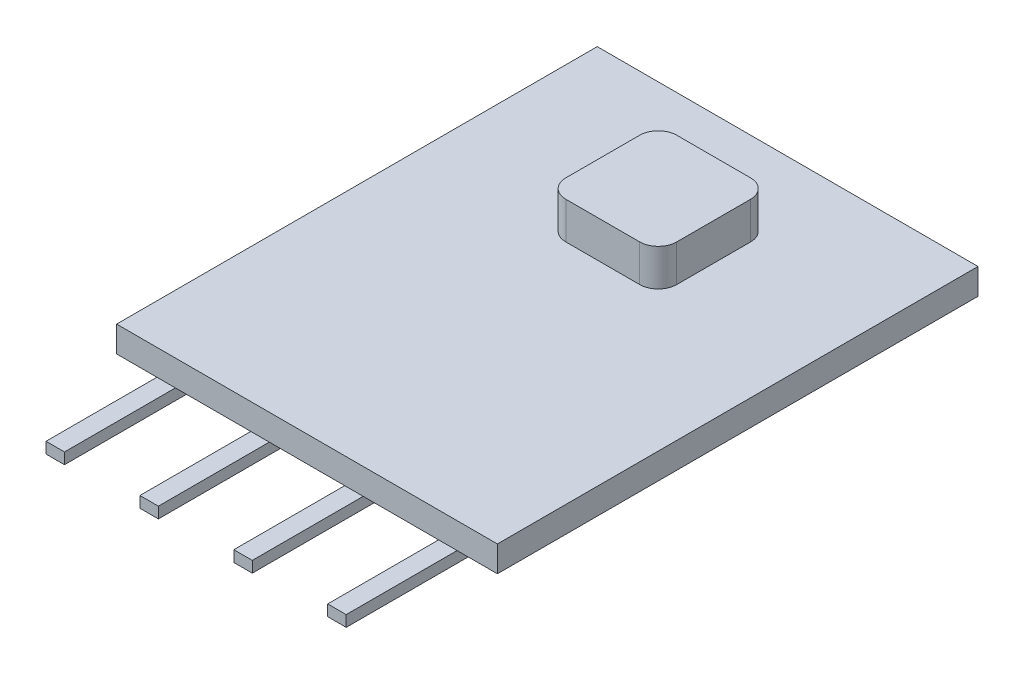
ISO-10303-21;
HEADER;
FILE_DESCRIPTION(('STEP AP214'),'2;1');
FILE_NAME('part.step','',(''),(''),'','','');
FILE_SCHEMA(('AUTOMOTIVE_DESIGN { 1 0 10303 214 1 1 1 1 }'));
ENDSEC;
DATA;
#1=APPLICATION_CONTEXT('core data for automotive mechanical design processes');
#2=APPLICATION_PROTOCOL_DEFINITION('international standard','automotive_design',2000,#1);
#3=PRODUCT_CONTEXT('',#1,'mechanical');
#4=PRODUCT('Part','Part','',(#3));
#5=PRODUCT_RELATED_PRODUCT_CATEGORY('part','',(#4));
#6=PRODUCT_DEFINITION_FORMATION('','',#4);
#7=PRODUCT_DEFINITION_CONTEXT('part definition',#1,'design');
#8=PRODUCT_DEFINITION('design','',#6,#7);
#9=PRODUCT_DEFINITION_SHAPE('','',#8);
#10=(LENGTH_UNIT() NAMED_UNIT(*) SI_UNIT(.MILLI.,.METRE.));
#11=(NAMED_UNIT(*) PLANE_ANGLE_UNIT() SI_UNIT($,.RADIAN.));
#12=(NAMED_UNIT(*) SI_UNIT($,.STERADIAN.) SOLID_ANGLE_UNIT());
#13=UNCERTAINTY_MEASURE_WITH_UNIT(LENGTH_MEASURE(1.E-05),#10,'distance_accuracy_value','');
#14=(GEOMETRIC_REPRESENTATION_CONTEXT(3) GLOBAL_UNCERTAINTY_ASSIGNED_CONTEXT((#13)) GLOBAL_UNIT_ASSIGNED_CONTEXT((#10,
#11,#12)) REPRESENTATION_CONTEXT('',''));
#15=CARTESIAN_POINT('',(0.,0.,0.));
#16=DIRECTION('',(0.,0.,1.));
#17=DIRECTION('',(1.,0.,0.));
#18=AXIS2_PLACEMENT_3D('',#15,#16,#17);
#19=CARTESIAN_POINT('',(1.5,1.7,-4.5));
#20=DIRECTION('',(-1.,0.,0.));
#21=DIRECTION('',(0.,0.,1.));
#22=AXIS2_PLACEMENT_3D('',#19,#20,#21);
#23=PLANE('',#22);
#24=DIRECTION('',(0.,0.,-1.));
#25=VECTOR('',#24,1.);
#26=CARTESIAN_POINT('',(1.5,0.7,-4.5));
#27=LINE('',#26,#25);
#28=CARTESIAN_POINT('',(1.5,0.7,-2.));
#29=VERTEX_POINT('',#28);
#30=CARTESIAN_POINT('',(1.5,0.7,-4.));
#31=VERTEX_POINT('',#30);
#32=EDGE_CURVE('E142',#29,#31,#27,.T.);
#33=ORIENTED_EDGE('',*,*,#32,.T.);
#34=DIRECTION('',(0.,-1.,0.));
#35=VECTOR('',#34,1.);
#36=CARTESIAN_POINT('',(1.5,1.7,-4.));
#37=LINE('',#36,#35);
#38=CARTESIAN_POINT('',(1.5,1.7,-4.));
#39=VERTEX_POINT('',#38);
#40=EDGE_CURVE('E164',#31,#39,#37,.F.);
#41=ORIENTED_EDGE('',*,*,#40,.T.);
#42=DIRECTION('',(0.,0.,-1.));
#43=VECTOR('',#42,1.);
#44=CARTESIAN_POINT('',(1.5,1.7,-4.5));
#45=LINE('',#44,#43);
#46=CARTESIAN_POINT('',(1.5,1.7,-2.));
#47=VERTEX_POINT('',#46);
#48=EDGE_CURVE('E140',#47,#39,#45,.T.);
#49=ORIENTED_EDGE('',*,*,#48,.F.);
#50=DIRECTION('',(0.,-1.,0.));
#51=VECTOR('',#50,1.);
#52=CARTESIAN_POINT('',(1.5,1.7,-2.));
#53=LINE('',#52,#51);
#54=EDGE_CURVE('E161',#47,#29,#53,.T.);
#55=ORIENTED_EDGE('',*,*,#54,.T.);
#56=EDGE_LOOP('',(#33,#41,#49,#55));
#57=FACE_BOUND('',#56,.T.);
#58=ADVANCED_FACE('F45',(#57),#23,.F.);
#59=CARTESIAN_POINT('',(-1.5,1.7,-4.5));
#60=DIRECTION('',(0.,0.,1.));
#61=DIRECTION('',(1.,0.,0.));
#62=AXIS2_PLACEMENT_3D('',#59,#60,#61);
#63=PLANE('',#62);
#64=DIRECTION('',(-1.,0.,0.));
#65=VECTOR('',#64,1.);
#66=CARTESIAN_POINT('',(-1.5,0.7,-4.5));
#67=LINE('',#66,#65);
#68=CARTESIAN_POINT('',(1.,0.7,-4.5));
#69=VERTEX_POINT('',#68);
#70=CARTESIAN_POINT('',(-1.,0.7,-4.5));
#71=VERTEX_POINT('',#70);
#72=EDGE_CURVE('E138',#69,#71,#67,.T.);
#73=ORIENTED_EDGE('',*,*,#72,.T.);
#74=DIRECTION('',(0.,-1.,0.));
#75=VECTOR('',#74,1.);
#76=CARTESIAN_POINT('',(-1.,1.7,-4.5));
#77=LINE('',#76,#75);
#78=CARTESIAN_POINT('',(-1.,1.7,-4.5));
#79=VERTEX_POINT('',#78);
#80=EDGE_CURVE('E116',#71,#79,#77,.F.);
#81=ORIENTED_EDGE('',*,*,#80,.T.);
#82=DIRECTION('',(-1.,0.,0.));
#83=VECTOR('',#82,1.);
#84=CARTESIAN_POINT('',(-1.5,1.7,-4.5));
#85=LINE('',#84,#83);
#86=CARTESIAN_POINT('',(1.,1.7,-4.5));
#87=VERTEX_POINT('',#86);
#88=EDGE_CURVE('E178',#87,#79,#85,.T.);
#89=ORIENTED_EDGE('',*,*,#88,.F.);
#90=DIRECTION('',(0.,-1.,0.));
#91=VECTOR('',#90,1.);
#92=CARTESIAN_POINT('',(1.,1.7,-4.5));
#93=LINE('',#92,#91);
#94=EDGE_CURVE('E121',#87,#69,#93,.T.);
#95=ORIENTED_EDGE('',*,*,#94,.T.);
#96=EDGE_LOOP('',(#73,#81,#89,#95));
#97=FACE_BOUND('',#96,.T.);
#98=ADVANCED_FACE('F183',(#97),#63,.F.);
#99=CARTESIAN_POINT('',(-1.5,1.7,-4.5));
#100=DIRECTION('',(1.,0.,0.));
#101=DIRECTION('',(0.,0.,-1.));
#102=AXIS2_PLACEMENT_3D('',#99,#100,#101);
#103=PLANE('',#102);
#104=DIRECTION('',(0.,0.,1.));
#105=VECTOR('',#104,1.);
#106=CARTESIAN_POINT('',(-1.5,1.7,-4.5));
#107=LINE('',#106,#105);
#108=CARTESIAN_POINT('',(-1.5,1.7,-4.));
#109=VERTEX_POINT('',#108);
#110=CARTESIAN_POINT('',(-1.5,1.7,-2.));
#111=VERTEX_POINT('',#110);
#112=EDGE_CURVE('E130',#109,#111,#107,.T.);
#113=ORIENTED_EDGE('',*,*,#112,.F.);
#114=DIRECTION('',(0.,-1.,0.));
#115=VECTOR('',#114,1.);
#116=CARTESIAN_POINT('',(-1.5,1.7,-4.));
#117=LINE('',#116,#115);
#118=CARTESIAN_POINT('',(-1.5,0.7,-4.));
#119=VERTEX_POINT('',#118);
#120=EDGE_CURVE('E115',#109,#119,#117,.T.);
#121=ORIENTED_EDGE('',*,*,#120,.T.);
#122=DIRECTION('',(0.,0.,1.));
#123=VECTOR('',#122,1.);
#124=CARTESIAN_POINT('',(-1.5,0.7,-4.5));
#125=LINE('',#124,#123);
#126=CARTESIAN_POINT('',(-1.5,0.7,-2.));
#127=VERTEX_POINT('',#126);
#128=EDGE_CURVE('E128',#119,#127,#125,.T.);
#129=ORIENTED_EDGE('',*,*,#128,.T.);
#130=DIRECTION('',(0.,-1.,0.));
#131=VECTOR('',#130,1.);
#132=CARTESIAN_POINT('',(-1.5,1.7,-2.));
#133=LINE('',#132,#131);
#134=EDGE_CURVE('E132',#127,#111,#133,.F.);
#135=ORIENTED_EDGE('',*,*,#134,.T.);
#136=EDGE_LOOP('',(#113,#121,#129,#135));
#137=FACE_BOUND('',#136,.T.);
#138=ADVANCED_FACE('F127',(#137),#103,.F.);
#139=CARTESIAN_POINT('',(-1.5,1.7,-1.5));
#140=DIRECTION('',(0.,0.,-1.));
#141=DIRECTION('',(-1.,0.,0.));
#142=AXIS2_PLACEMENT_3D('',#139,#140,#141);
#143=PLANE('',#142);
#144=DIRECTION('',(1.,0.,0.));
#145=VECTOR('',#144,1.);
#146=CARTESIAN_POINT('',(-1.5,1.7,-1.5));
#147=LINE('',#146,#145);
#148=CARTESIAN_POINT('',(-1.,1.7,-1.5));
#149=VERTEX_POINT('',#148);
#150=CARTESIAN_POINT('',(1.,1.7,-1.5));
#151=VERTEX_POINT('',#150);
#152=EDGE_CURVE('E146',#149,#151,#147,.T.);
#153=ORIENTED_EDGE('',*,*,#152,.F.);
#154=DIRECTION('',(0.,-1.,0.));
#155=VECTOR('',#154,1.);
#156=CARTESIAN_POINT('',(-1.,1.7,-1.5));
#157=LINE('',#156,#155);
#158=CARTESIAN_POINT('',(-1.,0.7,-1.5));
#159=VERTEX_POINT('',#158);
#160=EDGE_CURVE('E12',#149,#159,#157,.T.);
#161=ORIENTED_EDGE('',*,*,#160,.T.);
#162=DIRECTION('',(1.,0.,0.));
#163=VECTOR('',#162,1.);
#164=CARTESIAN_POINT('',(-1.5,0.7,-1.5));
#165=LINE('',#164,#163);
#166=CARTESIAN_POINT('',(1.,0.7,-1.5));
#167=VERTEX_POINT('',#166);
#168=EDGE_CURVE('E137',#159,#167,#165,.T.);
#169=ORIENTED_EDGE('',*,*,#168,.T.);
#170=DIRECTION('',(0.,-1.,0.));
#171=VECTOR('',#170,1.);
#172=CARTESIAN_POINT('',(1.,1.7,-1.5));
#173=LINE('',#172,#171);
#174=EDGE_CURVE('E53',#167,#151,#173,.F.);
#175=ORIENTED_EDGE('',*,*,#174,.T.);
#176=EDGE_LOOP('',(#153,#161,#169,#175));
#177=FACE_BOUND('',#176,.T.);
#178=ADVANCED_FACE('F190',(#177),#143,.F.);
#179=CARTESIAN_POINT('',(0.,1.7,0.));
#180=DIRECTION('',(0.,1.,0.));
#181=DIRECTION('',(0.,0.,1.));
#182=AXIS2_PLACEMENT_3D('',#179,#180,#181);
#183=PLANE('',#182);
#184=ORIENTED_EDGE('',*,*,#88,.T.);
#185=CARTESIAN_POINT('',(-1.,1.7,-4.));
#186=DIRECTION('',(0.,1.,0.));
#187=DIRECTION('',(0.,0.,1.));
#188=AXIS2_PLACEMENT_3D('',#185,#186,#187);
#189=CIRCLE('',#188,0.5);
#190=EDGE_CURVE('E159',#79,#109,#189,.T.);
#191=ORIENTED_EDGE('',*,*,#190,.T.);
#192=ORIENTED_EDGE('',*,*,#112,.T.);
#193=CARTESIAN_POINT('',(-1.,1.7,-2.));
#194=DIRECTION('',(0.,1.,0.));
#195=DIRECTION('',(0.,0.,1.));
#196=AXIS2_PLACEMENT_3D('',#193,#194,#195);
#197=CIRCLE('',#196,0.5);
#198=EDGE_CURVE('E66',#111,#149,#197,.T.);
#199=ORIENTED_EDGE('',*,*,#198,.T.);
#200=ORIENTED_EDGE('',*,*,#152,.T.);
#201=CARTESIAN_POINT('',(1.,1.7,-2.));
#202=DIRECTION('',(0.,1.,0.));
#203=DIRECTION('',(0.,0.,1.));
#204=AXIS2_PLACEMENT_3D('',#201,#202,#203);
#205=CIRCLE('',#204,0.5);
#206=EDGE_CURVE('E154',#151,#47,#205,.T.);
#207=ORIENTED_EDGE('',*,*,#206,.T.);
#208=ORIENTED_EDGE('',*,*,#48,.T.);
#209=CARTESIAN_POINT('',(1.,1.7,-4.));
#210=DIRECTION('',(0.,1.,0.));
#211=DIRECTION('',(0.,0.,1.));
#212=AXIS2_PLACEMENT_3D('',#209,#210,#211);
#213=CIRCLE('',#212,0.5);
#214=EDGE_CURVE('E157',#39,#87,#213,.T.);
#215=ORIENTED_EDGE('',*,*,#214,.T.);
#216=EDGE_LOOP('',(#184,#191,#192,#199,#200,#207,#208,#215));
#217=FACE_BOUND('',#216,.T.);
#218=ADVANCED_FACE('F175',(#217),#183,.T.);
#219=CARTESIAN_POINT('',(0.,0.7,0.));
#220=DIRECTION('',(0.,1.,0.));
#221=DIRECTION('',(0.,0.,1.));
#222=AXIS2_PLACEMENT_3D('',#219,#220,#221);
#223=PLANE('',#222);
#224=ORIENTED_EDGE('',*,*,#128,.F.);
#225=CARTESIAN_POINT('',(-1.,0.7,-4.));
#226=DIRECTION('',(0.,1.,0.));
#227=DIRECTION('',(0.,0.,1.));
#228=AXIS2_PLACEMENT_3D('',#225,#226,#227);
#229=CIRCLE('',#228,0.5);
#230=EDGE_CURVE('E111',#119,#71,#229,.F.);
#231=ORIENTED_EDGE('',*,*,#230,.T.);
#232=ORIENTED_EDGE('',*,*,#72,.F.);
#233=CARTESIAN_POINT('',(1.,0.7,-4.));
#234=DIRECTION('',(0.,1.,0.));
#235=DIRECTION('',(0.,0.,1.));
#236=AXIS2_PLACEMENT_3D('',#233,#234,#235);
#237=CIRCLE('',#236,0.5);
#238=EDGE_CURVE('E122',#69,#31,#237,.F.);
#239=ORIENTED_EDGE('',*,*,#238,.T.);
#240=ORIENTED_EDGE('',*,*,#32,.F.);
#241=CARTESIAN_POINT('',(1.,0.7,-2.));
#242=DIRECTION('',(0.,1.,0.));
#243=DIRECTION('',(0.,0.,1.));
#244=AXIS2_PLACEMENT_3D('',#241,#242,#243);
#245=CIRCLE('',#244,0.5);
#246=EDGE_CURVE('E131',#29,#167,#245,.F.);
#247=ORIENTED_EDGE('',*,*,#246,.T.);
#248=ORIENTED_EDGE('',*,*,#168,.F.);
#249=CARTESIAN_POINT('',(-1.,0.7,-2.));
#250=DIRECTION('',(0.,1.,0.));
#251=DIRECTION('',(0.,0.,1.));
#252=AXIS2_PLACEMENT_3D('',#249,#250,#251);
#253=CIRCLE('',#252,0.5);
#254=EDGE_CURVE('E136',#159,#127,#253,.F.);
#255=ORIENTED_EDGE('',*,*,#254,.T.);
#256=EDGE_LOOP('',(#224,#231,#232,#239,#240,#247,#248,#255));
#257=FACE_BOUND('',#256,.T.);
#258=ADVANCED_FACE('F134',(#257),#223,.F.);
#259=CARTESIAN_POINT('',(-1.,1.7,-4.));
#260=DIRECTION('',(0.,-1.,0.));
#261=DIRECTION('',(0.,0.,-1.));
#262=AXIS2_PLACEMENT_3D('',#259,#260,#261);
#263=CYLINDRICAL_SURFACE('',#262,0.5);
#264=ORIENTED_EDGE('',*,*,#190,.F.);
#265=ORIENTED_EDGE('',*,*,#80,.F.);
#266=ORIENTED_EDGE('',*,*,#230,.F.);
#267=ORIENTED_EDGE('',*,*,#120,.F.);
#268=EDGE_LOOP('',(#264,#265,#266,#267));
#269=FACE_BOUND('',#268,.T.);
#270=ADVANCED_FACE('F114',(#269),#263,.T.);
#271=CARTESIAN_POINT('',(1.,1.7,-4.));
#272=DIRECTION('',(0.,-1.,0.));
#273=DIRECTION('',(0.,0.,-1.));
#274=AXIS2_PLACEMENT_3D('',#271,#272,#273);
#275=CYLINDRICAL_SURFACE('',#274,0.5);
#276=ORIENTED_EDGE('',*,*,#214,.F.);
#277=ORIENTED_EDGE('',*,*,#40,.F.);
#278=ORIENTED_EDGE('',*,*,#238,.F.);
#279=ORIENTED_EDGE('',*,*,#94,.F.);
#280=EDGE_LOOP('',(#276,#277,#278,#279));
#281=FACE_BOUND('',#280,.T.);
#282=ADVANCED_FACE('F181',(#281),#275,.T.);
#283=CARTESIAN_POINT('',(-1.,1.7,-2.));
#284=DIRECTION('',(0.,-1.,0.));
#285=DIRECTION('',(0.,0.,-1.));
#286=AXIS2_PLACEMENT_3D('',#283,#284,#285);
#287=CYLINDRICAL_SURFACE('',#286,0.5);
#288=ORIENTED_EDGE('',*,*,#198,.F.);
#289=ORIENTED_EDGE('',*,*,#134,.F.);
#290=ORIENTED_EDGE('',*,*,#254,.F.);
#291=ORIENTED_EDGE('',*,*,#160,.F.);
#292=EDGE_LOOP('',(#288,#289,#290,#291));
#293=FACE_BOUND('',#292,.T.);
#294=ADVANCED_FACE('F189',(#293),#287,.T.);
#295=CARTESIAN_POINT('',(1.,1.7,-2.));
#296=DIRECTION('',(0.,-1.,0.));
#297=DIRECTION('',(0.,0.,-1.));
#298=AXIS2_PLACEMENT_3D('',#295,#296,#297);
#299=CYLINDRICAL_SURFACE('',#298,0.5);
#300=ORIENTED_EDGE('',*,*,#206,.F.);
#301=ORIENTED_EDGE('',*,*,#174,.F.);
#302=ORIENTED_EDGE('',*,*,#246,.F.);
#303=ORIENTED_EDGE('',*,*,#54,.F.);
#304=EDGE_LOOP('',(#300,#301,#302,#303));
#305=FACE_BOUND('',#304,.T.);
#306=ADVANCED_FACE('F47',(#305),#299,.T.);
#307=CLOSED_SHELL('',(#58,#98,#138,#178,#218,#258,#270,#282,#294,#306));
#308=MANIFOLD_SOLID_BREP('B2',#307);
#309=CARTESIAN_POINT('',(-5.15,0.7,6.5));
#310=DIRECTION('',(0.,0.,-1.));
#311=DIRECTION('',(-1.,0.,0.));
#312=AXIS2_PLACEMENT_3D('',#309,#310,#311);
#313=PLANE('',#312);
#314=DIRECTION('',(-1.,0.,0.));
#315=VECTOR('',#314,1.);
#316=CARTESIAN_POINT('',(4.06,0.,6.5));
#317=LINE('',#316,#315);
#318=CARTESIAN_POINT('',(4.06,0.,6.5));
#319=VERTEX_POINT('',#318);
#320=CARTESIAN_POINT('',(3.56,0.,6.5));
#321=VERTEX_POINT('',#320);
#322=EDGE_CURVE('E456',#319,#321,#317,.T.);
#323=ORIENTED_EDGE('',*,*,#322,.F.);
#324=DIRECTION('',(1.,0.,0.));
#325=VECTOR('',#324,1.);
#326=CARTESIAN_POINT('',(-5.15,0.,6.5));
#327=LINE('',#326,#325);
#328=CARTESIAN_POINT('',(5.15,0.,6.5));
#329=VERTEX_POINT('',#328);
#330=EDGE_CURVE('E616',#319,#329,#327,.T.);
#331=ORIENTED_EDGE('',*,*,#330,.T.);
#332=DIRECTION('',(0.,-1.,0.));
#333=VECTOR('',#332,1.);
#334=CARTESIAN_POINT('',(5.15,0.7,6.5));
#335=LINE('',#334,#333);
#336=CARTESIAN_POINT('',(5.15,0.7,6.5));
#337=VERTEX_POINT('',#336);
#338=EDGE_CURVE('E609',#337,#329,#335,.T.);
#339=ORIENTED_EDGE('',*,*,#338,.F.);
#340=DIRECTION('',(1.,0.,0.));
#341=VECTOR('',#340,1.);
#342=CARTESIAN_POINT('',(-5.15,0.7,6.5));
#343=LINE('',#342,#341);
#344=CARTESIAN_POINT('',(-5.15,0.7,6.5));
#345=VERTEX_POINT('',#344);
#346=EDGE_CURVE('E607',#345,#337,#343,.T.);
#347=ORIENTED_EDGE('',*,*,#346,.F.);
#348=DIRECTION('',(0.,-1.,0.));
#349=VECTOR('',#348,1.);
#350=CARTESIAN_POINT('',(-5.15,0.7,6.5));
#351=LINE('',#350,#349);
#352=CARTESIAN_POINT('',(-5.15,0.,6.5));
#353=VERTEX_POINT('',#352);
#354=EDGE_CURVE('E621',#345,#353,#351,.T.);
#355=ORIENTED_EDGE('',*,*,#354,.T.);
#356=CARTESIAN_POINT('',(-4.06,0.,6.5));
#357=VERTEX_POINT('',#356);
#358=EDGE_CURVE('E603',#353,#357,#327,.T.);
#359=ORIENTED_EDGE('',*,*,#358,.T.);
#360=DIRECTION('',(-1.,0.,0.));
#361=VECTOR('',#360,1.);
#362=CARTESIAN_POINT('',(-3.56,0.,6.5));
#363=LINE('',#362,#361);
#364=CARTESIAN_POINT('',(-3.56,0.,6.5));
#365=VERTEX_POINT('',#364);
#366=EDGE_CURVE('E296',#365,#357,#363,.T.);
#367=ORIENTED_EDGE('',*,*,#366,.F.);
#368=CARTESIAN_POINT('',(-1.52,0.,6.5));
#369=VERTEX_POINT('',#368);
#370=EDGE_CURVE('E618',#365,#369,#327,.T.);
#371=ORIENTED_EDGE('',*,*,#370,.T.);
#372=DIRECTION('',(-1.,0.,0.));
#373=VECTOR('',#372,1.);
#374=CARTESIAN_POINT('',(-1.02,0.,6.5));
#375=LINE('',#374,#373);
#376=CARTESIAN_POINT('',(-1.02,0.,6.5));
#377=VERTEX_POINT('',#376);
#378=EDGE_CURVE('E486',#377,#369,#375,.T.);
#379=ORIENTED_EDGE('',*,*,#378,.F.);
#380=CARTESIAN_POINT('',(1.02,0.,6.5));
#381=VERTEX_POINT('',#380);
#382=EDGE_CURVE('E645',#377,#381,#327,.T.);
#383=ORIENTED_EDGE('',*,*,#382,.T.);
#384=DIRECTION('',(-1.,0.,0.));
#385=VECTOR('',#384,1.);
#386=CARTESIAN_POINT('',(1.52,0.,6.5));
#387=LINE('',#386,#385);
#388=CARTESIAN_POINT('',(1.52,0.,6.5));
#389=VERTEX_POINT('',#388);
#390=EDGE_CURVE('E464',#389,#381,#387,.T.);
#391=ORIENTED_EDGE('',*,*,#390,.F.);
#392=EDGE_CURVE('E643',#389,#321,#327,.T.);
#393=ORIENTED_EDGE('',*,*,#392,.T.);
#394=EDGE_LOOP('',(#323,#331,#339,#347,#355,#359,#367,#371,#379,#383,#391,#393));
#395=FACE_BOUND('',#394,.T.);
#396=ADVANCED_FACE('F273',(#395),#313,.F.);
#397=CARTESIAN_POINT('',(0.,0.,0.));
#398=DIRECTION('',(0.,-1.,0.));
#399=DIRECTION('',(0.,0.,-1.));
#400=AXIS2_PLACEMENT_3D('',#397,#398,#399);
#401=PLANE('',#400);
#402=DIRECTION('',(1.,0.,0.));
#403=VECTOR('',#402,1.);
#404=CARTESIAN_POINT('',(4.06,0.,6.));
#405=LINE('',#404,#403);
#406=CARTESIAN_POINT('',(3.56,0.,6.));
#407=VERTEX_POINT('',#406);
#408=CARTESIAN_POINT('',(4.06,0.,6.));
#409=VERTEX_POINT('',#408);
#410=EDGE_CURVE('E515',#407,#409,#405,.T.);
#411=ORIENTED_EDGE('',*,*,#410,.F.);
#412=DIRECTION('',(0.,0.,-1.));
#413=VECTOR('',#412,1.);
#414=CARTESIAN_POINT('',(3.56,0.,6.));
#415=LINE('',#414,#413);
#416=EDGE_CURVE('E504',#321,#407,#415,.T.);
#417=ORIENTED_EDGE('',*,*,#416,.F.);
#418=ORIENTED_EDGE('',*,*,#392,.F.);
#419=DIRECTION('',(0.,0.,1.));
#420=VECTOR('',#419,1.);
#421=CARTESIAN_POINT('',(1.52,0.,6.));
#422=LINE('',#421,#420);
#423=CARTESIAN_POINT('',(1.52,0.,6.));
#424=VERTEX_POINT('',#423);
#425=EDGE_CURVE('E526',#424,#389,#422,.T.);
#426=ORIENTED_EDGE('',*,*,#425,.F.);
#427=DIRECTION('',(1.,0.,0.));
#428=VECTOR('',#427,1.);
#429=CARTESIAN_POINT('',(1.52,0.,6.));
#430=LINE('',#429,#428);
#431=CARTESIAN_POINT('',(1.02,0.,6.));
#432=VERTEX_POINT('',#431);
#433=EDGE_CURVE('E533',#432,#424,#430,.T.);
#434=ORIENTED_EDGE('',*,*,#433,.F.);
#435=DIRECTION('',(0.,0.,-1.));
#436=VECTOR('',#435,1.);
#437=CARTESIAN_POINT('',(1.02,0.,6.));
#438=LINE('',#437,#436);
#439=EDGE_CURVE('E521',#381,#432,#438,.T.);
#440=ORIENTED_EDGE('',*,*,#439,.F.);
#441=ORIENTED_EDGE('',*,*,#382,.F.);
#442=DIRECTION('',(0.,0.,1.));
#443=VECTOR('',#442,1.);
#444=CARTESIAN_POINT('',(-1.02,0.,6.));
#445=LINE('',#444,#443);
#446=CARTESIAN_POINT('',(-1.02,0.,6.));
#447=VERTEX_POINT('',#446);
#448=EDGE_CURVE('E546',#447,#377,#445,.T.);
#449=ORIENTED_EDGE('',*,*,#448,.F.);
#450=DIRECTION('',(1.,0.,0.));
#451=VECTOR('',#450,1.);
#452=CARTESIAN_POINT('',(-1.02,0.,6.));
#453=LINE('',#452,#451);
#454=CARTESIAN_POINT('',(-1.52,0.,6.));
#455=VERTEX_POINT('',#454);
#456=EDGE_CURVE('E553',#455,#447,#453,.T.);
#457=ORIENTED_EDGE('',*,*,#456,.F.);
#458=DIRECTION('',(0.,0.,-1.));
#459=VECTOR('',#458,1.);
#460=CARTESIAN_POINT('',(-1.52,0.,6.));
#461=LINE('',#460,#459);
#462=EDGE_CURVE('E541',#369,#455,#461,.T.);
#463=ORIENTED_EDGE('',*,*,#462,.F.);
#464=ORIENTED_EDGE('',*,*,#370,.F.);
#465=DIRECTION('',(0.,0.,1.));
#466=VECTOR('',#465,1.);
#467=CARTESIAN_POINT('',(-3.56,0.,6.));
#468=LINE('',#467,#466);
#469=CARTESIAN_POINT('',(-3.56,0.,6.));
#470=VERTEX_POINT('',#469);
#471=EDGE_CURVE('E584',#470,#365,#468,.T.);
#472=ORIENTED_EDGE('',*,*,#471,.F.);
#473=DIRECTION('',(1.,0.,0.));
#474=VECTOR('',#473,1.);
#475=CARTESIAN_POINT('',(-3.56,0.,6.));
#476=LINE('',#475,#474);
#477=CARTESIAN_POINT('',(-4.06,0.,6.));
#478=VERTEX_POINT('',#477);
#479=EDGE_CURVE('E288',#478,#470,#476,.T.);
#480=ORIENTED_EDGE('',*,*,#479,.F.);
#481=DIRECTION('',(0.,0.,-1.));
#482=VECTOR('',#481,1.);
#483=CARTESIAN_POINT('',(-4.06,0.,6.));
#484=LINE('',#483,#482);
#485=EDGE_CURVE('E579',#357,#478,#484,.T.);
#486=ORIENTED_EDGE('',*,*,#485,.F.);
#487=ORIENTED_EDGE('',*,*,#358,.F.);
#488=DIRECTION('',(0.,0.,1.));
#489=VECTOR('',#488,1.);
#490=CARTESIAN_POINT('',(-5.15,0.,6.5));
#491=LINE('',#490,#489);
#492=CARTESIAN_POINT('',(-5.15,0.,-6.5));
#493=VERTEX_POINT('',#492);
#494=EDGE_CURVE('E614',#493,#353,#491,.T.);
#495=ORIENTED_EDGE('',*,*,#494,.F.);
#496=DIRECTION('',(-1.,0.,0.));
#497=VECTOR('',#496,1.);
#498=CARTESIAN_POINT('',(-5.15,0.,-6.5));
#499=LINE('',#498,#497);
#500=CARTESIAN_POINT('',(5.15,0.,-6.5));
#501=VERTEX_POINT('',#500);
#502=EDGE_CURVE('E612',#501,#493,#499,.T.);
#503=ORIENTED_EDGE('',*,*,#502,.F.);
#504=DIRECTION('',(0.,0.,-1.));
#505=VECTOR('',#504,1.);
#506=CARTESIAN_POINT('',(5.15,0.,6.5));
#507=LINE('',#506,#505);
#508=EDGE_CURVE('E598',#329,#501,#507,.T.);
#509=ORIENTED_EDGE('',*,*,#508,.F.);
#510=ORIENTED_EDGE('',*,*,#330,.F.);
#511=DIRECTION('',(0.,0.,1.));
#512=VECTOR('',#511,1.);
#513=CARTESIAN_POINT('',(4.06,0.,6.));
#514=LINE('',#513,#512);
#515=EDGE_CURVE('E462',#409,#319,#514,.T.);
#516=ORIENTED_EDGE('',*,*,#515,.F.);
#517=EDGE_LOOP('',(#411,#417,#418,#426,#434,#440,#441,#449,#457,#463,#464,#472,#480,#486,#487,
#495,#503,#509,#510,#516));
#518=FACE_BOUND('',#517,.T.);
#519=ADVANCED_FACE('F633',(#518),#401,.T.);
#520=CARTESIAN_POINT('',(5.15,0.7,6.5));
#521=DIRECTION('',(-1.,0.,0.));
#522=DIRECTION('',(0.,0.,1.));
#523=AXIS2_PLACEMENT_3D('',#520,#521,#522);
#524=PLANE('',#523);
#525=ORIENTED_EDGE('',*,*,#508,.T.);
#526=DIRECTION('',(0.,-1.,0.));
#527=VECTOR('',#526,1.);
#528=CARTESIAN_POINT('',(5.15,0.7,-6.5));
#529=LINE('',#528,#527);
#530=CARTESIAN_POINT('',(5.15,0.7,-6.5));
#531=VERTEX_POINT('',#530);
#532=EDGE_CURVE('E43',#531,#501,#529,.T.);
#533=ORIENTED_EDGE('',*,*,#532,.F.);
#534=DIRECTION('',(0.,0.,-1.));
#535=VECTOR('',#534,1.);
#536=CARTESIAN_POINT('',(5.15,0.7,6.5));
#537=LINE('',#536,#535);
#538=EDGE_CURVE('E599',#337,#531,#537,.T.);
#539=ORIENTED_EDGE('',*,*,#538,.F.);
#540=ORIENTED_EDGE('',*,*,#338,.T.);
#541=EDGE_LOOP('',(#525,#533,#539,#540));
#542=FACE_BOUND('',#541,.T.);
#543=ADVANCED_FACE('F275',(#542),#524,.F.);
#544=CARTESIAN_POINT('',(-5.15,0.7,-6.5));
#545=DIRECTION('',(0.,0.,1.));
#546=DIRECTION('',(1.,0.,0.));
#547=AXIS2_PLACEMENT_3D('',#544,#545,#546);
#548=PLANE('',#547);
#549=ORIENTED_EDGE('',*,*,#502,.T.);
#550=DIRECTION('',(0.,-1.,0.));
#551=VECTOR('',#550,1.);
#552=CARTESIAN_POINT('',(-5.15,0.7,-6.5));
#553=LINE('',#552,#551);
#554=CARTESIAN_POINT('',(-5.15,0.7,-6.5));
#555=VERTEX_POINT('',#554);
#556=EDGE_CURVE('E281',#555,#493,#553,.T.);
#557=ORIENTED_EDGE('',*,*,#556,.F.);
#558=DIRECTION('',(-1.,0.,0.));
#559=VECTOR('',#558,1.);
#560=CARTESIAN_POINT('',(-5.15,0.7,-6.5));
#561=LINE('',#560,#559);
#562=EDGE_CURVE('E602',#531,#555,#561,.T.);
#563=ORIENTED_EDGE('',*,*,#562,.F.);
#564=ORIENTED_EDGE('',*,*,#532,.T.);
#565=EDGE_LOOP('',(#549,#557,#563,#564));
#566=FACE_BOUND('',#565,.T.);
#567=ADVANCED_FACE('F641',(#566),#548,.F.);
#568=CARTESIAN_POINT('',(-5.15,0.7,6.5));
#569=DIRECTION('',(1.,0.,0.));
#570=DIRECTION('',(0.,0.,-1.));
#571=AXIS2_PLACEMENT_3D('',#568,#569,#570);
#572=PLANE('',#571);
#573=ORIENTED_EDGE('',*,*,#494,.T.);
#574=ORIENTED_EDGE('',*,*,#354,.F.);
#575=DIRECTION('',(0.,0.,1.));
#576=VECTOR('',#575,1.);
#577=CARTESIAN_POINT('',(-5.15,0.7,6.5));
#578=LINE('',#577,#576);
#579=EDGE_CURVE('E605',#555,#345,#578,.T.);
#580=ORIENTED_EDGE('',*,*,#579,.F.);
#581=ORIENTED_EDGE('',*,*,#556,.T.);
#582=EDGE_LOOP('',(#573,#574,#580,#581));
#583=FACE_BOUND('',#582,.T.);
#584=ADVANCED_FACE('F628',(#583),#572,.F.);
#585=CARTESIAN_POINT('',(0.,0.7,0.));
#586=DIRECTION('',(0.,-1.,0.));
#587=DIRECTION('',(0.,0.,-1.));
#588=AXIS2_PLACEMENT_3D('',#585,#586,#587);
#589=PLANE('',#588);
#590=ORIENTED_EDGE('',*,*,#538,.T.);
#591=ORIENTED_EDGE('',*,*,#562,.T.);
#592=ORIENTED_EDGE('',*,*,#579,.T.);
#593=ORIENTED_EDGE('',*,*,#346,.T.);
#594=EDGE_LOOP('',(#590,#591,#592,#593));
#595=FACE_BOUND('',#594,.T.);
#596=ADVANCED_FACE('F639',(#595),#589,.F.);
#597=CARTESIAN_POINT('',(-4.06,-0.3,6.));
#598=DIRECTION('',(1.,0.,0.));
#599=DIRECTION('',(0.,0.,-1.));
#600=AXIS2_PLACEMENT_3D('',#597,#598,#599);
#601=PLANE('',#600);
#602=ORIENTED_EDGE('',*,*,#485,.T.);
#603=DIRECTION('',(0.,1.,0.));
#604=VECTOR('',#603,1.);
#605=CARTESIAN_POINT('',(-4.06,-0.3,6.));
#606=LINE('',#605,#604);
#607=CARTESIAN_POINT('',(-4.06,-0.3,6.));
#608=VERTEX_POINT('',#607);
#609=EDGE_CURVE('E596',#608,#478,#606,.T.);
#610=ORIENTED_EDGE('',*,*,#609,.F.);
#611=DIRECTION('',(0.,0.,-1.));
#612=VECTOR('',#611,1.);
#613=CARTESIAN_POINT('',(-4.06,-0.3,6.));
#614=LINE('',#613,#612);
#615=CARTESIAN_POINT('',(-4.06,-0.3,9.5));
#616=VERTEX_POINT('',#615);
#617=EDGE_CURVE('E580',#616,#608,#614,.T.);
#618=ORIENTED_EDGE('',*,*,#617,.F.);
#619=DIRECTION('',(0.,-1.,0.));
#620=VECTOR('',#619,1.);
#621=CARTESIAN_POINT('',(-4.06,-0.3,9.5));
#622=LINE('',#621,#620);
#623=CARTESIAN_POINT('',(-4.06,0.,9.5));
#624=VERTEX_POINT('',#623);
#625=EDGE_CURVE('E566',#624,#616,#622,.T.);
#626=ORIENTED_EDGE('',*,*,#625,.F.);
#627=DIRECTION('',(0.,0.,-1.));
#628=VECTOR('',#627,1.);
#629=CARTESIAN_POINT('',(-4.06,0.,9.5));
#630=LINE('',#629,#628);
#631=EDGE_CURVE('E572',#624,#357,#630,.T.);
#632=ORIENTED_EDGE('',*,*,#631,.T.);
#633=EDGE_LOOP('',(#602,#610,#618,#626,#632));
#634=FACE_BOUND('',#633,.T.);
#635=ADVANCED_FACE('F672',(#634),#601,.F.);
#636=CARTESIAN_POINT('',(-3.56,-0.3,6.));
#637=DIRECTION('',(0.,0.,1.));
#638=DIRECTION('',(1.,0.,0.));
#639=AXIS2_PLACEMENT_3D('',#636,#637,#638);
#640=PLANE('',#639);
#641=ORIENTED_EDGE('',*,*,#479,.T.);
#642=DIRECTION('',(0.,1.,0.));
#643=VECTOR('',#642,1.);
#644=CARTESIAN_POINT('',(-3.56,-0.3,6.));
#645=LINE('',#644,#643);
#646=CARTESIAN_POINT('',(-3.56,-0.3,6.));
#647=VERTEX_POINT('',#646);
#648=EDGE_CURVE('E588',#647,#470,#645,.T.);
#649=ORIENTED_EDGE('',*,*,#648,.F.);
#650=DIRECTION('',(1.,0.,0.));
#651=VECTOR('',#650,1.);
#652=CARTESIAN_POINT('',(-3.56,-0.3,6.));
#653=LINE('',#652,#651);
#654=EDGE_CURVE('E583',#608,#647,#653,.T.);
#655=ORIENTED_EDGE('',*,*,#654,.F.);
#656=ORIENTED_EDGE('',*,*,#609,.T.);
#657=EDGE_LOOP('',(#641,#649,#655,#656));
#658=FACE_BOUND('',#657,.T.);
#659=ADVANCED_FACE('F670',(#658),#640,.F.);
#660=CARTESIAN_POINT('',(-3.56,-0.3,6.));
#661=DIRECTION('',(-1.,0.,0.));
#662=DIRECTION('',(0.,0.,1.));
#663=AXIS2_PLACEMENT_3D('',#660,#661,#662);
#664=PLANE('',#663);
#665=ORIENTED_EDGE('',*,*,#471,.T.);
#666=DIRECTION('',(0.,0.,-1.));
#667=VECTOR('',#666,1.);
#668=CARTESIAN_POINT('',(-3.56,0.,9.5));
#669=LINE('',#668,#667);
#670=CARTESIAN_POINT('',(-3.56,0.,9.5));
#671=VERTEX_POINT('',#670);
#672=EDGE_CURVE('E576',#671,#365,#669,.T.);
#673=ORIENTED_EDGE('',*,*,#672,.F.);
#674=DIRECTION('',(0.,1.,0.));
#675=VECTOR('',#674,1.);
#676=CARTESIAN_POINT('',(-3.56,-0.3,9.5));
#677=LINE('',#676,#675);
#678=CARTESIAN_POINT('',(-3.56,-0.3,9.5));
#679=VERTEX_POINT('',#678);
#680=EDGE_CURVE('E561',#679,#671,#677,.T.);
#681=ORIENTED_EDGE('',*,*,#680,.F.);
#682=DIRECTION('',(0.,0.,1.));
#683=VECTOR('',#682,1.);
#684=CARTESIAN_POINT('',(-3.56,-0.3,6.));
#685=LINE('',#684,#683);
#686=EDGE_CURVE('E586',#647,#679,#685,.T.);
#687=ORIENTED_EDGE('',*,*,#686,.F.);
#688=ORIENTED_EDGE('',*,*,#648,.T.);
#689=EDGE_LOOP('',(#665,#673,#681,#687,#688));
#690=FACE_BOUND('',#689,.T.);
#691=ADVANCED_FACE('F655',(#690),#664,.F.);
#692=CARTESIAN_POINT('',(0.,-0.3,0.));
#693=DIRECTION('',(0.,-1.,0.));
#694=DIRECTION('',(0.,0.,-1.));
#695=AXIS2_PLACEMENT_3D('',#692,#693,#694);
#696=PLANE('',#695);
#697=ORIENTED_EDGE('',*,*,#617,.T.);
#698=ORIENTED_EDGE('',*,*,#654,.T.);
#699=ORIENTED_EDGE('',*,*,#686,.T.);
#700=DIRECTION('',(1.,0.,0.));
#701=VECTOR('',#700,1.);
#702=CARTESIAN_POINT('',(-3.56,-0.3,9.5));
#703=LINE('',#702,#701);
#704=EDGE_CURVE('E569',#616,#679,#703,.T.);
#705=ORIENTED_EDGE('',*,*,#704,.F.);
#706=EDGE_LOOP('',(#697,#698,#699,#705));
#707=FACE_BOUND('',#706,.T.);
#708=ADVANCED_FACE('F667',(#707),#696,.T.);
#709=CARTESIAN_POINT('',(-3.56,0.,9.5));
#710=DIRECTION('',(0.,-1.,0.));
#711=DIRECTION('',(0.,0.,-1.));
#712=AXIS2_PLACEMENT_3D('',#709,#710,#711);
#713=PLANE('',#712);
#714=ORIENTED_EDGE('',*,*,#366,.T.);
#715=ORIENTED_EDGE('',*,*,#631,.F.);
#716=DIRECTION('',(-1.,0.,0.));
#717=VECTOR('',#716,1.);
#718=CARTESIAN_POINT('',(-3.56,0.,9.5));
#719=LINE('',#718,#717);
#720=EDGE_CURVE('E564',#671,#624,#719,.T.);
#721=ORIENTED_EDGE('',*,*,#720,.F.);
#722=ORIENTED_EDGE('',*,*,#672,.T.);
#723=EDGE_LOOP('',(#714,#715,#721,#722));
#724=FACE_BOUND('',#723,.T.);
#725=ADVANCED_FACE('F660',(#724),#713,.F.);
#726=CARTESIAN_POINT('',(0.,0.,9.5));
#727=DIRECTION('',(0.,0.,1.));
#728=DIRECTION('',(1.,0.,0.));
#729=AXIS2_PLACEMENT_3D('',#726,#727,#728);
#730=PLANE('',#729);
#731=ORIENTED_EDGE('',*,*,#680,.T.);
#732=ORIENTED_EDGE('',*,*,#720,.T.);
#733=ORIENTED_EDGE('',*,*,#625,.T.);
#734=ORIENTED_EDGE('',*,*,#704,.T.);
#735=EDGE_LOOP('',(#731,#732,#733,#734));
#736=FACE_BOUND('',#735,.T.);
#737=ADVANCED_FACE('F664',(#736),#730,.T.);
#738=CARTESIAN_POINT('',(-1.52,-0.3,6.));
#739=DIRECTION('',(1.,0.,0.));
#740=DIRECTION('',(0.,0.,-1.));
#741=AXIS2_PLACEMENT_3D('',#738,#739,#740);
#742=PLANE('',#741);
#743=ORIENTED_EDGE('',*,*,#462,.T.);
#744=DIRECTION('',(0.,1.,0.));
#745=VECTOR('',#744,1.);
#746=CARTESIAN_POINT('',(-1.52,-0.3,6.));
#747=LINE('',#746,#745);
#748=CARTESIAN_POINT('',(-1.52,-0.3,6.));
#749=VERTEX_POINT('',#748);
#750=EDGE_CURVE('E559',#749,#455,#747,.T.);
#751=ORIENTED_EDGE('',*,*,#750,.F.);
#752=DIRECTION('',(0.,0.,-1.));
#753=VECTOR('',#752,1.);
#754=CARTESIAN_POINT('',(-1.52,-0.3,6.));
#755=LINE('',#754,#753);
#756=CARTESIAN_POINT('',(-1.52,-0.3,9.5));
#757=VERTEX_POINT('',#756);
#758=EDGE_CURVE('E542',#757,#749,#755,.T.);
#759=ORIENTED_EDGE('',*,*,#758,.F.);
#760=DIRECTION('',(0.,-1.,0.));
#761=VECTOR('',#760,1.);
#762=CARTESIAN_POINT('',(-1.52,-0.3,9.5));
#763=LINE('',#762,#761);
#764=CARTESIAN_POINT('',(-1.52,0.,9.5));
#765=VERTEX_POINT('',#764);
#766=EDGE_CURVE('E492',#765,#757,#763,.T.);
#767=ORIENTED_EDGE('',*,*,#766,.F.);
#768=DIRECTION('',(0.,0.,-1.));
#769=VECTOR('',#768,1.);
#770=CARTESIAN_POINT('',(-1.52,0.,9.5));
#771=LINE('',#770,#769);
#772=EDGE_CURVE('E498',#765,#369,#771,.T.);
#773=ORIENTED_EDGE('',*,*,#772,.T.);
#774=EDGE_LOOP('',(#743,#751,#759,#767,#773));
#775=FACE_BOUND('',#774,.T.);
#776=ADVANCED_FACE('F709',(#775),#742,.F.);
#777=CARTESIAN_POINT('',(-1.02,-0.3,6.));
#778=DIRECTION('',(0.,0.,1.));
#779=DIRECTION('',(1.,0.,0.));
#780=AXIS2_PLACEMENT_3D('',#777,#778,#779);
#781=PLANE('',#780);
#782=ORIENTED_EDGE('',*,*,#456,.T.);
#783=DIRECTION('',(0.,1.,0.));
#784=VECTOR('',#783,1.);
#785=CARTESIAN_POINT('',(-1.02,-0.3,6.));
#786=LINE('',#785,#784);
#787=CARTESIAN_POINT('',(-1.02,-0.3,6.));
#788=VERTEX_POINT('',#787);
#789=EDGE_CURVE('E550',#788,#447,#786,.T.);
#790=ORIENTED_EDGE('',*,*,#789,.F.);
#791=DIRECTION('',(1.,0.,0.));
#792=VECTOR('',#791,1.);
#793=CARTESIAN_POINT('',(-1.02,-0.3,6.));
#794=LINE('',#793,#792);
#795=EDGE_CURVE('E545',#749,#788,#794,.T.);
#796=ORIENTED_EDGE('',*,*,#795,.F.);
#797=ORIENTED_EDGE('',*,*,#750,.T.);
#798=EDGE_LOOP('',(#782,#790,#796,#797));
#799=FACE_BOUND('',#798,.T.);
#800=ADVANCED_FACE('F715',(#799),#781,.F.);
#801=CARTESIAN_POINT('',(-1.02,-0.3,6.));
#802=DIRECTION('',(-1.,0.,0.));
#803=DIRECTION('',(0.,0.,1.));
#804=AXIS2_PLACEMENT_3D('',#801,#802,#803);
#805=PLANE('',#804);
#806=ORIENTED_EDGE('',*,*,#448,.T.);
#807=DIRECTION('',(0.,0.,-1.));
#808=VECTOR('',#807,1.);
#809=CARTESIAN_POINT('',(-1.02,0.,9.5));
#810=LINE('',#809,#808);
#811=CARTESIAN_POINT('',(-1.02,0.,9.5));
#812=VERTEX_POINT('',#811);
#813=EDGE_CURVE('E502',#812,#377,#810,.T.);
#814=ORIENTED_EDGE('',*,*,#813,.F.);
#815=DIRECTION('',(0.,1.,0.));
#816=VECTOR('',#815,1.);
#817=CARTESIAN_POINT('',(-1.02,-0.3,9.5));
#818=LINE('',#817,#816);
#819=CARTESIAN_POINT('',(-1.02,-0.3,9.5));
#820=VERTEX_POINT('',#819);
#821=EDGE_CURVE('E487',#820,#812,#818,.T.);
#822=ORIENTED_EDGE('',*,*,#821,.F.);
#823=DIRECTION('',(0.,0.,1.));
#824=VECTOR('',#823,1.);
#825=CARTESIAN_POINT('',(-1.02,-0.3,6.));
#826=LINE('',#825,#824);
#827=EDGE_CURVE('E548',#788,#820,#826,.T.);
#828=ORIENTED_EDGE('',*,*,#827,.F.);
#829=ORIENTED_EDGE('',*,*,#789,.T.);
#830=EDGE_LOOP('',(#806,#814,#822,#828,#829));
#831=FACE_BOUND('',#830,.T.);
#832=ADVANCED_FACE('F729',(#831),#805,.F.);
#833=CARTESIAN_POINT('',(2.54,-0.3,0.));
#834=DIRECTION('',(0.,-1.,0.));
#835=DIRECTION('',(0.,0.,-1.));
#836=AXIS2_PLACEMENT_3D('',#833,#834,#835);
#837=PLANE('',#836);
#838=ORIENTED_EDGE('',*,*,#758,.T.);
#839=ORIENTED_EDGE('',*,*,#795,.T.);
#840=ORIENTED_EDGE('',*,*,#827,.T.);
#841=DIRECTION('',(1.,0.,0.));
#842=VECTOR('',#841,1.);
#843=CARTESIAN_POINT('',(-1.02,-0.3,9.5));
#844=LINE('',#843,#842);
#845=EDGE_CURVE('E495',#757,#820,#844,.T.);
#846=ORIENTED_EDGE('',*,*,#845,.F.);
#847=EDGE_LOOP('',(#838,#839,#840,#846));
#848=FACE_BOUND('',#847,.T.);
#849=ADVANCED_FACE('F742',(#848),#837,.T.);
#850=CARTESIAN_POINT('',(1.02,-0.3,6.));
#851=DIRECTION('',(1.,0.,0.));
#852=DIRECTION('',(0.,0.,-1.));
#853=AXIS2_PLACEMENT_3D('',#850,#851,#852);
#854=PLANE('',#853);
#855=ORIENTED_EDGE('',*,*,#439,.T.);
#856=DIRECTION('',(0.,1.,0.));
#857=VECTOR('',#856,1.);
#858=CARTESIAN_POINT('',(1.02,-0.3,6.));
#859=LINE('',#858,#857);
#860=CARTESIAN_POINT('',(1.02,-0.3,6.));
#861=VERTEX_POINT('',#860);
#862=EDGE_CURVE('E539',#861,#432,#859,.T.);
#863=ORIENTED_EDGE('',*,*,#862,.F.);
#864=DIRECTION('',(0.,0.,-1.));
#865=VECTOR('',#864,1.);
#866=CARTESIAN_POINT('',(1.02,-0.3,6.));
#867=LINE('',#866,#865);
#868=CARTESIAN_POINT('',(1.02,-0.3,9.5));
#869=VERTEX_POINT('',#868);
#870=EDGE_CURVE('E522',#869,#861,#867,.T.);
#871=ORIENTED_EDGE('',*,*,#870,.F.);
#872=DIRECTION('',(0.,-1.,0.));
#873=VECTOR('',#872,1.);
#874=CARTESIAN_POINT('',(1.02,-0.3,9.5));
#875=LINE('',#874,#873);
#876=CARTESIAN_POINT('',(1.02,0.,9.5));
#877=VERTEX_POINT('',#876);
#878=EDGE_CURVE('E475',#877,#869,#875,.T.);
#879=ORIENTED_EDGE('',*,*,#878,.F.);
#880=DIRECTION('',(0.,0.,-1.));
#881=VECTOR('',#880,1.);
#882=CARTESIAN_POINT('',(1.02,0.,9.5));
#883=LINE('',#882,#881);
#884=EDGE_CURVE('E480',#877,#381,#883,.T.);
#885=ORIENTED_EDGE('',*,*,#884,.T.);
#886=EDGE_LOOP('',(#855,#863,#871,#879,#885));
#887=FACE_BOUND('',#886,.T.);
#888=ADVANCED_FACE('F755',(#887),#854,.F.);
#889=CARTESIAN_POINT('',(1.52,-0.3,6.));
#890=DIRECTION('',(0.,0.,1.));
#891=DIRECTION('',(1.,0.,0.));
#892=AXIS2_PLACEMENT_3D('',#889,#890,#891);
#893=PLANE('',#892);
#894=ORIENTED_EDGE('',*,*,#433,.T.);
#895=DIRECTION('',(0.,1.,0.));
#896=VECTOR('',#895,1.);
#897=CARTESIAN_POINT('',(1.52,-0.3,6.));
#898=LINE('',#897,#896);
#899=CARTESIAN_POINT('',(1.52,-0.3,6.));
#900=VERTEX_POINT('',#899);
#901=EDGE_CURVE('E530',#900,#424,#898,.T.);
#902=ORIENTED_EDGE('',*,*,#901,.F.);
#903=DIRECTION('',(1.,0.,0.));
#904=VECTOR('',#903,1.);
#905=CARTESIAN_POINT('',(1.52,-0.3,6.));
#906=LINE('',#905,#904);
#907=EDGE_CURVE('E525',#861,#900,#906,.T.);
#908=ORIENTED_EDGE('',*,*,#907,.F.);
#909=ORIENTED_EDGE('',*,*,#862,.T.);
#910=EDGE_LOOP('',(#894,#902,#908,#909));
#911=FACE_BOUND('',#910,.T.);
#912=ADVANCED_FACE('F767',(#911),#893,.F.);
#913=CARTESIAN_POINT('',(1.52,-0.3,6.));
#914=DIRECTION('',(-1.,0.,0.));
#915=DIRECTION('',(0.,0.,1.));
#916=AXIS2_PLACEMENT_3D('',#913,#914,#915);
#917=PLANE('',#916);
#918=ORIENTED_EDGE('',*,*,#425,.T.);
#919=DIRECTION('',(0.,0.,-1.));
#920=VECTOR('',#919,1.);
#921=CARTESIAN_POINT('',(1.52,0.,9.5));
#922=LINE('',#921,#920);
#923=CARTESIAN_POINT('',(1.52,0.,9.5));
#924=VERTEX_POINT('',#923);
#925=EDGE_CURVE('E484',#924,#389,#922,.T.);
#926=ORIENTED_EDGE('',*,*,#925,.F.);
#927=DIRECTION('',(0.,1.,0.));
#928=VECTOR('',#927,1.);
#929=CARTESIAN_POINT('',(1.52,-0.3,9.5));
#930=LINE('',#929,#928);
#931=CARTESIAN_POINT('',(1.52,-0.3,9.5));
#932=VERTEX_POINT('',#931);
#933=EDGE_CURVE('E466',#932,#924,#930,.T.);
#934=ORIENTED_EDGE('',*,*,#933,.F.);
#935=DIRECTION('',(0.,0.,1.));
#936=VECTOR('',#935,1.);
#937=CARTESIAN_POINT('',(1.52,-0.3,6.));
#938=LINE('',#937,#936);
#939=EDGE_CURVE('E528',#900,#932,#938,.T.);
#940=ORIENTED_EDGE('',*,*,#939,.F.);
#941=ORIENTED_EDGE('',*,*,#901,.T.);
#942=EDGE_LOOP('',(#918,#926,#934,#940,#941));
#943=FACE_BOUND('',#942,.T.);
#944=ADVANCED_FACE('F780',(#943),#917,.F.);
#945=CARTESIAN_POINT('',(5.08,-0.3,0.));
#946=DIRECTION('',(0.,-1.,0.));
#947=DIRECTION('',(0.,0.,-1.));
#948=AXIS2_PLACEMENT_3D('',#945,#946,#947);
#949=PLANE('',#948);
#950=ORIENTED_EDGE('',*,*,#870,.T.);
#951=ORIENTED_EDGE('',*,*,#907,.T.);
#952=ORIENTED_EDGE('',*,*,#939,.T.);
#953=DIRECTION('',(1.,0.,0.));
#954=VECTOR('',#953,1.);
#955=CARTESIAN_POINT('',(1.52,-0.3,9.5));
#956=LINE('',#955,#954);
#957=EDGE_CURVE('E478',#869,#932,#956,.T.);
#958=ORIENTED_EDGE('',*,*,#957,.F.);
#959=EDGE_LOOP('',(#950,#951,#952,#958));
#960=FACE_BOUND('',#959,.T.);
#961=ADVANCED_FACE('F790',(#960),#949,.T.);
#962=CARTESIAN_POINT('',(3.56,-0.3,6.));
#963=DIRECTION('',(1.,0.,0.));
#964=DIRECTION('',(0.,0.,-1.));
#965=AXIS2_PLACEMENT_3D('',#962,#963,#964);
#966=PLANE('',#965);
#967=ORIENTED_EDGE('',*,*,#416,.T.);
#968=DIRECTION('',(0.,1.,0.));
#969=VECTOR('',#968,1.);
#970=CARTESIAN_POINT('',(3.56,-0.3,6.));
#971=LINE('',#970,#969);
#972=CARTESIAN_POINT('',(3.56,-0.3,6.));
#973=VERTEX_POINT('',#972);
#974=EDGE_CURVE('E519',#973,#407,#971,.T.);
#975=ORIENTED_EDGE('',*,*,#974,.F.);
#976=DIRECTION('',(0.,0.,-1.));
#977=VECTOR('',#976,1.);
#978=CARTESIAN_POINT('',(3.56,-0.3,6.));
#979=LINE('',#978,#977);
#980=CARTESIAN_POINT('',(3.56,-0.3,9.5));
#981=VERTEX_POINT('',#980);
#982=EDGE_CURVE('E505',#981,#973,#979,.T.);
#983=ORIENTED_EDGE('',*,*,#982,.F.);
#984=DIRECTION('',(0.,-1.,0.));
#985=VECTOR('',#984,1.);
#986=CARTESIAN_POINT('',(3.56,-0.3,9.5));
#987=LINE('',#986,#985);
#988=CARTESIAN_POINT('',(3.56,0.,9.5));
#989=VERTEX_POINT('',#988);
#990=EDGE_CURVE('E446',#989,#981,#987,.T.);
#991=ORIENTED_EDGE('',*,*,#990,.F.);
#992=DIRECTION('',(0.,0.,-1.));
#993=VECTOR('',#992,1.);
#994=CARTESIAN_POINT('',(3.56,0.,9.5));
#995=LINE('',#994,#993);
#996=EDGE_CURVE('E442',#989,#321,#995,.T.);
#997=ORIENTED_EDGE('',*,*,#996,.T.);
#998=EDGE_LOOP('',(#967,#975,#983,#991,#997));
#999=FACE_BOUND('',#998,.T.);
#1000=ADVANCED_FACE('F800',(#999),#966,.F.);
#1001=CARTESIAN_POINT('',(4.06,-0.3,6.));
#1002=DIRECTION('',(0.,0.,1.));
#1003=DIRECTION('',(1.,0.,0.));
#1004=AXIS2_PLACEMENT_3D('',#1001,#1002,#1003);
#1005=PLANE('',#1004);
#1006=ORIENTED_EDGE('',*,*,#410,.T.);
#1007=DIRECTION('',(0.,1.,0.));
#1008=VECTOR('',#1007,1.);
#1009=CARTESIAN_POINT('',(4.06,-0.3,6.));
#1010=LINE('',#1009,#1008);
#1011=CARTESIAN_POINT('',(4.06,-0.3,6.));
#1012=VERTEX_POINT('',#1011);
#1013=EDGE_CURVE('E512',#1012,#409,#1010,.T.);
#1014=ORIENTED_EDGE('',*,*,#1013,.F.);
#1015=DIRECTION('',(1.,0.,0.));
#1016=VECTOR('',#1015,1.);
#1017=CARTESIAN_POINT('',(4.06,-0.3,6.));
#1018=LINE('',#1017,#1016);
#1019=EDGE_CURVE('E508',#973,#1012,#1018,.T.);
#1020=ORIENTED_EDGE('',*,*,#1019,.F.);
#1021=ORIENTED_EDGE('',*,*,#974,.T.);
#1022=EDGE_LOOP('',(#1006,#1014,#1020,#1021));
#1023=FACE_BOUND('',#1022,.T.);
#1024=ADVANCED_FACE('F811',(#1023),#1005,.F.);
#1025=CARTESIAN_POINT('',(4.06,-0.3,6.));
#1026=DIRECTION('',(-1.,0.,0.));
#1027=DIRECTION('',(0.,0.,1.));
#1028=AXIS2_PLACEMENT_3D('',#1025,#1026,#1027);
#1029=PLANE('',#1028);
#1030=ORIENTED_EDGE('',*,*,#515,.T.);
#1031=DIRECTION('',(0.,0.,-1.));
#1032=VECTOR('',#1031,1.);
#1033=CARTESIAN_POINT('',(4.06,0.,9.5));
#1034=LINE('',#1033,#1032);
#1035=CARTESIAN_POINT('',(4.06,0.,9.5));
#1036=VERTEX_POINT('',#1035);
#1037=EDGE_CURVE('E439',#1036,#319,#1034,.T.);
#1038=ORIENTED_EDGE('',*,*,#1037,.F.);
#1039=DIRECTION('',(0.,1.,0.));
#1040=VECTOR('',#1039,1.);
#1041=CARTESIAN_POINT('',(4.06,-0.3,9.5));
#1042=LINE('',#1041,#1040);
#1043=CARTESIAN_POINT('',(4.06,-0.3,9.5));
#1044=VERTEX_POINT('',#1043);
#1045=EDGE_CURVE('E447',#1044,#1036,#1042,.T.);
#1046=ORIENTED_EDGE('',*,*,#1045,.F.);
#1047=DIRECTION('',(0.,0.,1.));
#1048=VECTOR('',#1047,1.);
#1049=CARTESIAN_POINT('',(4.06,-0.3,6.));
#1050=LINE('',#1049,#1048);
#1051=EDGE_CURVE('E510',#1012,#1044,#1050,.T.);
#1052=ORIENTED_EDGE('',*,*,#1051,.F.);
#1053=ORIENTED_EDGE('',*,*,#1013,.T.);
#1054=EDGE_LOOP('',(#1030,#1038,#1046,#1052,#1053));
#1055=FACE_BOUND('',#1054,.T.);
#1056=ADVANCED_FACE('F459',(#1055),#1029,.F.);
#1057=CARTESIAN_POINT('',(7.62,-0.3,0.));
#1058=DIRECTION('',(0.,-1.,0.));
#1059=DIRECTION('',(0.,0.,-1.));
#1060=AXIS2_PLACEMENT_3D('',#1057,#1058,#1059);
#1061=PLANE('',#1060);
#1062=ORIENTED_EDGE('',*,*,#982,.T.);
#1063=ORIENTED_EDGE('',*,*,#1019,.T.);
#1064=ORIENTED_EDGE('',*,*,#1051,.T.);
#1065=DIRECTION('',(1.,0.,0.));
#1066=VECTOR('',#1065,1.);
#1067=CARTESIAN_POINT('',(4.06,-0.3,9.5));
#1068=LINE('',#1067,#1066);
#1069=EDGE_CURVE('E453',#981,#1044,#1068,.T.);
#1070=ORIENTED_EDGE('',*,*,#1069,.F.);
#1071=EDGE_LOOP('',(#1062,#1063,#1064,#1070));
#1072=FACE_BOUND('',#1071,.T.);
#1073=ADVANCED_FACE('F833',(#1072),#1061,.T.);
#1074=CARTESIAN_POINT('',(-1.02,0.,9.5));
#1075=DIRECTION('',(0.,-1.,0.));
#1076=DIRECTION('',(0.,0.,-1.));
#1077=AXIS2_PLACEMENT_3D('',#1074,#1075,#1076);
#1078=PLANE('',#1077);
#1079=ORIENTED_EDGE('',*,*,#378,.T.);
#1080=ORIENTED_EDGE('',*,*,#772,.F.);
#1081=DIRECTION('',(-1.,0.,0.));
#1082=VECTOR('',#1081,1.);
#1083=CARTESIAN_POINT('',(-1.02,0.,9.5));
#1084=LINE('',#1083,#1082);
#1085=EDGE_CURVE('E490',#812,#765,#1084,.T.);
#1086=ORIENTED_EDGE('',*,*,#1085,.F.);
#1087=ORIENTED_EDGE('',*,*,#813,.T.);
#1088=EDGE_LOOP('',(#1079,#1080,#1086,#1087));
#1089=FACE_BOUND('',#1088,.T.);
#1090=ADVANCED_FACE('F842',(#1089),#1078,.F.);
#1091=CARTESIAN_POINT('',(2.54,0.,9.5));
#1092=DIRECTION('',(0.,0.,1.));
#1093=DIRECTION('',(1.,0.,0.));
#1094=AXIS2_PLACEMENT_3D('',#1091,#1092,#1093);
#1095=PLANE('',#1094);
#1096=ORIENTED_EDGE('',*,*,#821,.T.);
#1097=ORIENTED_EDGE('',*,*,#1085,.T.);
#1098=ORIENTED_EDGE('',*,*,#766,.T.);
#1099=ORIENTED_EDGE('',*,*,#845,.T.);
#1100=EDGE_LOOP('',(#1096,#1097,#1098,#1099));
#1101=FACE_BOUND('',#1100,.T.);
#1102=ADVANCED_FACE('F854',(#1101),#1095,.T.);
#1103=CARTESIAN_POINT('',(1.52,0.,9.5));
#1104=DIRECTION('',(0.,-1.,0.));
#1105=DIRECTION('',(0.,0.,-1.));
#1106=AXIS2_PLACEMENT_3D('',#1103,#1104,#1105);
#1107=PLANE('',#1106);
#1108=ORIENTED_EDGE('',*,*,#390,.T.);
#1109=ORIENTED_EDGE('',*,*,#884,.F.);
#1110=DIRECTION('',(-1.,0.,0.));
#1111=VECTOR('',#1110,1.);
#1112=CARTESIAN_POINT('',(1.52,0.,9.5));
#1113=LINE('',#1112,#1111);
#1114=EDGE_CURVE('E473',#924,#877,#1113,.T.);
#1115=ORIENTED_EDGE('',*,*,#1114,.F.);
#1116=ORIENTED_EDGE('',*,*,#925,.T.);
#1117=EDGE_LOOP('',(#1108,#1109,#1115,#1116));
#1118=FACE_BOUND('',#1117,.T.);
#1119=ADVANCED_FACE('F865',(#1118),#1107,.F.);
#1120=CARTESIAN_POINT('',(5.08,0.,9.5));
#1121=DIRECTION('',(0.,0.,1.));
#1122=DIRECTION('',(1.,0.,0.));
#1123=AXIS2_PLACEMENT_3D('',#1120,#1121,#1122);
#1124=PLANE('',#1123);
#1125=ORIENTED_EDGE('',*,*,#933,.T.);
#1126=ORIENTED_EDGE('',*,*,#1114,.T.);
#1127=ORIENTED_EDGE('',*,*,#878,.T.);
#1128=ORIENTED_EDGE('',*,*,#957,.T.);
#1129=EDGE_LOOP('',(#1125,#1126,#1127,#1128));
#1130=FACE_BOUND('',#1129,.T.);
#1131=ADVANCED_FACE('F877',(#1130),#1124,.T.);
#1132=CARTESIAN_POINT('',(4.06,0.,9.5));
#1133=DIRECTION('',(0.,-1.,0.));
#1134=DIRECTION('',(0.,0.,-1.));
#1135=AXIS2_PLACEMENT_3D('',#1132,#1133,#1134);
#1136=PLANE('',#1135);
#1137=ORIENTED_EDGE('',*,*,#322,.T.);
#1138=ORIENTED_EDGE('',*,*,#996,.F.);
#1139=DIRECTION('',(-1.,0.,0.));
#1140=VECTOR('',#1139,1.);
#1141=CARTESIAN_POINT('',(4.06,0.,9.5));
#1142=LINE('',#1141,#1140);
#1143=EDGE_CURVE('E435',#1036,#989,#1142,.T.);
#1144=ORIENTED_EDGE('',*,*,#1143,.F.);
#1145=ORIENTED_EDGE('',*,*,#1037,.T.);
#1146=EDGE_LOOP('',(#1137,#1138,#1144,#1145));
#1147=FACE_BOUND('',#1146,.T.);
#1148=ADVANCED_FACE('F437',(#1147),#1136,.F.);
#1149=CARTESIAN_POINT('',(7.62,0.,9.5));
#1150=DIRECTION('',(0.,0.,1.));
#1151=DIRECTION('',(1.,0.,0.));
#1152=AXIS2_PLACEMENT_3D('',#1149,#1150,#1151);
#1153=PLANE('',#1152);
#1154=ORIENTED_EDGE('',*,*,#1045,.T.);
#1155=ORIENTED_EDGE('',*,*,#1143,.T.);
#1156=ORIENTED_EDGE('',*,*,#990,.T.);
#1157=ORIENTED_EDGE('',*,*,#1069,.T.);
#1158=EDGE_LOOP('',(#1154,#1155,#1156,#1157));
#1159=FACE_BOUND('',#1158,.T.);
#1160=ADVANCED_FACE('F451',(#1159),#1153,.T.);
#1161=CLOSED_SHELL('',(#396,#519,#543,#567,#584,#596,#635,#659,#691,#708,#725,#737,#776,#800,
#832,#849,#888,#912,#944,#961,#1000,#1024,#1056,#1073,#1090,#1102,#1119,#1131,#1148,#1160));
#1162=MANIFOLD_SOLID_BREP('B6',#1161);
#1163=ADVANCED_BREP_SHAPE_REPRESENTATION('',(#18,#308,#1162),#14);
#1164=SHAPE_DEFINITION_REPRESENTATION(#9,#1163);
ENDSEC;
END-ISO-10303-21;
